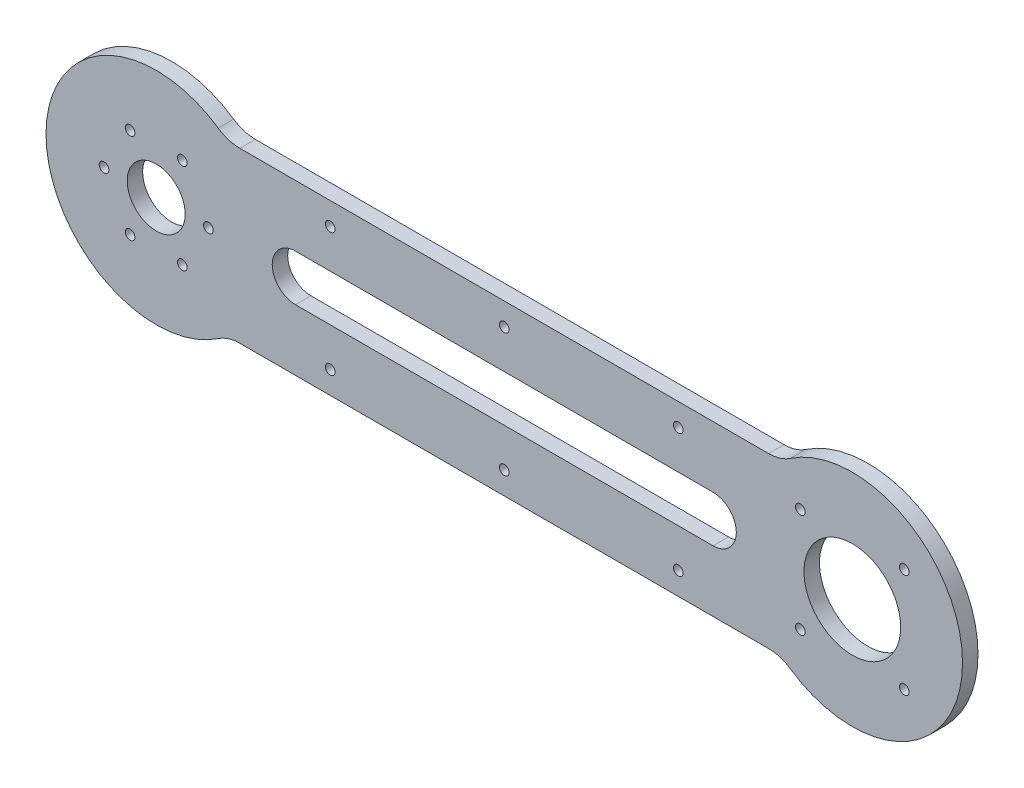
ISO-10303-21;
HEADER;
FILE_DESCRIPTION(('STEP AP214'),'2;1');
FILE_NAME('part.step','',(''),(''),'','','');
FILE_SCHEMA(('AUTOMOTIVE_DESIGN { 1 0 10303 214 1 1 1 1 }'));
ENDSEC;
DATA;
#1=APPLICATION_CONTEXT('core data for automotive mechanical design processes');
#2=APPLICATION_PROTOCOL_DEFINITION('international standard','automotive_design',2000,#1);
#3=PRODUCT_CONTEXT('',#1,'mechanical');
#4=PRODUCT('Part','Part','',(#3));
#5=PRODUCT_RELATED_PRODUCT_CATEGORY('part','',(#4));
#6=PRODUCT_DEFINITION_FORMATION('','',#4);
#7=PRODUCT_DEFINITION_CONTEXT('part definition',#1,'design');
#8=PRODUCT_DEFINITION('design','',#6,#7);
#9=PRODUCT_DEFINITION_SHAPE('','',#8);
#10=(LENGTH_UNIT() NAMED_UNIT(*) SI_UNIT(.MILLI.,.METRE.));
#11=(NAMED_UNIT(*) PLANE_ANGLE_UNIT() SI_UNIT($,.RADIAN.));
#12=(NAMED_UNIT(*) SI_UNIT($,.STERADIAN.) SOLID_ANGLE_UNIT());
#13=UNCERTAINTY_MEASURE_WITH_UNIT(LENGTH_MEASURE(1.E-05),#10,'distance_accuracy_value','');
#14=(GEOMETRIC_REPRESENTATION_CONTEXT(3) GLOBAL_UNCERTAINTY_ASSIGNED_CONTEXT((#13)) GLOBAL_UNIT_ASSIGNED_CONTEXT((#10,
#11,#12)) REPRESENTATION_CONTEXT('',''));
#15=CARTESIAN_POINT('',(0.,0.,0.));
#16=DIRECTION('',(0.,0.,1.));
#17=DIRECTION('',(1.,0.,0.));
#18=AXIS2_PLACEMENT_3D('',#15,#16,#17);
#19=CARTESIAN_POINT('',(135.,-16.,-1.));
#20=DIRECTION('',(0.,0.,1.));
#21=DIRECTION('',(1.,0.,0.));
#22=AXIS2_PLACEMENT_3D('',#19,#20,#21);
#23=CYLINDRICAL_SURFACE('',#22,1.25);
#24=CARTESIAN_POINT('',(135.,-16.,4.));
#25=DIRECTION('',(0.,0.,1.));
#26=DIRECTION('',(-1.,0.,0.));
#27=AXIS2_PLACEMENT_3D('',#24,#25,#26);
#28=CIRCLE('',#27,1.25);
#29=CARTESIAN_POINT('',(133.75,-16.,4.));
#30=VERTEX_POINT('',#29);
#31=EDGE_CURVE('E55',#30,#30,#28,.T.);
#32=ORIENTED_EDGE('',*,*,#31,.T.);
#33=EDGE_LOOP('',(#32));
#34=FACE_BOUND('',#33,.T.);
#35=CARTESIAN_POINT('',(135.,-16.,0.));
#36=DIRECTION('',(0.,0.,1.));
#37=DIRECTION('',(1.,0.,0.));
#38=AXIS2_PLACEMENT_3D('',#35,#36,#37);
#39=CIRCLE('',#38,1.25);
#40=CARTESIAN_POINT('',(136.25,-16.,0.));
#41=VERTEX_POINT('',#40);
#42=EDGE_CURVE('E11',#41,#41,#39,.T.);
#43=ORIENTED_EDGE('',*,*,#42,.F.);
#44=EDGE_LOOP('',(#43));
#45=FACE_BOUND('',#44,.T.);
#46=ADVANCED_FACE('F47',(#34,#45),#23,.F.);
#47=CARTESIAN_POINT('',(135.,16.,-1.));
#48=DIRECTION('',(0.,0.,1.));
#49=DIRECTION('',(1.,0.,0.));
#50=AXIS2_PLACEMENT_3D('',#47,#48,#49);
#51=CYLINDRICAL_SURFACE('',#50,1.25);
#52=CARTESIAN_POINT('',(135.,16.,4.));
#53=DIRECTION('',(0.,0.,1.));
#54=DIRECTION('',(1.,0.,0.));
#55=AXIS2_PLACEMENT_3D('',#52,#53,#54);
#56=CIRCLE('',#55,1.25);
#57=CARTESIAN_POINT('',(136.25,16.,4.));
#58=VERTEX_POINT('',#57);
#59=EDGE_CURVE('E308',#58,#58,#56,.T.);
#60=ORIENTED_EDGE('',*,*,#59,.T.);
#61=EDGE_LOOP('',(#60));
#62=FACE_BOUND('',#61,.T.);
#63=CARTESIAN_POINT('',(135.,16.,0.));
#64=DIRECTION('',(0.,0.,1.));
#65=DIRECTION('',(1.,0.,0.));
#66=AXIS2_PLACEMENT_3D('',#63,#64,#65);
#67=CIRCLE('',#66,1.25);
#68=CARTESIAN_POINT('',(136.25,16.,0.));
#69=VERTEX_POINT('',#68);
#70=EDGE_CURVE('E322',#69,#69,#67,.T.);
#71=ORIENTED_EDGE('',*,*,#70,.F.);
#72=EDGE_LOOP('',(#71));
#73=FACE_BOUND('',#72,.T.);
#74=ADVANCED_FACE('F347',(#62,#73),#51,.F.);
#75=CARTESIAN_POINT('',(144.,0.,0.));
#76=DIRECTION('',(0.,0.,1.));
#77=DIRECTION('',(1.,0.,0.));
#78=AXIS2_PLACEMENT_3D('',#75,#76,#77);
#79=CYLINDRICAL_SURFACE('',#78,6.);
#80=DIRECTION('',(0.,0.,-1.));
#81=VECTOR('',#80,1.);
#82=CARTESIAN_POINT('',(144.,6.,0.));
#83=LINE('',#82,#81);
#84=CARTESIAN_POINT('',(144.,6.,0.));
#85=VERTEX_POINT('',#84);
#86=CARTESIAN_POINT('',(144.,6.,4.));
#87=VERTEX_POINT('',#86);
#88=EDGE_CURVE('E297',#85,#87,#83,.F.);
#89=ORIENTED_EDGE('',*,*,#88,.F.);
#90=CARTESIAN_POINT('',(144.,0.,0.));
#91=DIRECTION('',(0.,0.,1.));
#92=DIRECTION('',(1.,0.,0.));
#93=AXIS2_PLACEMENT_3D('',#90,#91,#92);
#94=CIRCLE('',#93,6.);
#95=CARTESIAN_POINT('',(144.,-6.,0.));
#96=VERTEX_POINT('',#95);
#97=EDGE_CURVE('E69',#85,#96,#94,.F.);
#98=ORIENTED_EDGE('',*,*,#97,.T.);
#99=DIRECTION('',(0.,0.,-1.));
#100=VECTOR('',#99,1.);
#101=CARTESIAN_POINT('',(144.,-6.,0.));
#102=LINE('',#101,#100);
#103=CARTESIAN_POINT('',(144.,-6.,4.));
#104=VERTEX_POINT('',#103);
#105=EDGE_CURVE('E301',#104,#96,#102,.T.);
#106=ORIENTED_EDGE('',*,*,#105,.F.);
#107=CARTESIAN_POINT('',(144.,0.,4.));
#108=DIRECTION('',(0.,0.,1.));
#109=DIRECTION('',(1.,0.,0.));
#110=AXIS2_PLACEMENT_3D('',#107,#108,#109);
#111=CIRCLE('',#110,6.);
#112=EDGE_CURVE('E62',#104,#87,#111,.T.);
#113=ORIENTED_EDGE('',*,*,#112,.T.);
#114=EDGE_LOOP('',(#89,#98,#106,#113));
#115=FACE_BOUND('',#114,.T.);
#116=ADVANCED_FACE('F351',(#115),#79,.F.);
#117=CARTESIAN_POINT('',(36.,0.,4.));
#118=DIRECTION('',(0.,0.,1.));
#119=DIRECTION('',(1.,0.,0.));
#120=AXIS2_PLACEMENT_3D('',#117,#118,#119);
#121=CYLINDRICAL_SURFACE('',#120,6.);
#122=DIRECTION('',(0.,0.,-1.));
#123=VECTOR('',#122,1.);
#124=CARTESIAN_POINT('',(36.,6.,4.));
#125=LINE('',#124,#123);
#126=CARTESIAN_POINT('',(36.,6.,4.));
#127=VERTEX_POINT('',#126);
#128=CARTESIAN_POINT('',(36.,6.,0.));
#129=VERTEX_POINT('',#128);
#130=EDGE_CURVE('E282',#127,#129,#125,.T.);
#131=ORIENTED_EDGE('',*,*,#130,.F.);
#132=CARTESIAN_POINT('',(36.,0.,4.));
#133=DIRECTION('',(0.,0.,1.));
#134=DIRECTION('',(1.,0.,0.));
#135=AXIS2_PLACEMENT_3D('',#132,#133,#134);
#136=CIRCLE('',#135,6.);
#137=CARTESIAN_POINT('',(36.,-6.,4.));
#138=VERTEX_POINT('',#137);
#139=EDGE_CURVE('E290',#127,#138,#136,.T.);
#140=ORIENTED_EDGE('',*,*,#139,.T.);
#141=DIRECTION('',(0.,0.,-1.));
#142=VECTOR('',#141,1.);
#143=CARTESIAN_POINT('',(36.,-6.,4.));
#144=LINE('',#143,#142);
#145=CARTESIAN_POINT('',(36.,-6.,0.));
#146=VERTEX_POINT('',#145);
#147=EDGE_CURVE('E286',#146,#138,#144,.F.);
#148=ORIENTED_EDGE('',*,*,#147,.F.);
#149=CARTESIAN_POINT('',(36.,0.,0.));
#150=DIRECTION('',(0.,0.,1.));
#151=DIRECTION('',(1.,0.,0.));
#152=AXIS2_PLACEMENT_3D('',#149,#150,#151);
#153=CIRCLE('',#152,6.);
#154=EDGE_CURVE('E293',#146,#129,#153,.F.);
#155=ORIENTED_EDGE('',*,*,#154,.T.);
#156=EDGE_LOOP('',(#131,#140,#148,#155));
#157=FACE_BOUND('',#156,.T.);
#158=ADVANCED_FACE('F356',(#157),#121,.F.);
#159=CARTESIAN_POINT('',(0.,0.,4.));
#160=DIRECTION('',(0.,0.,-1.));
#161=DIRECTION('',(-1.,0.,0.));
#162=AXIS2_PLACEMENT_3D('',#159,#160,#161);
#163=CYLINDRICAL_SURFACE('',#162,28.5);
#164=CARTESIAN_POINT('',(0.,0.,0.));
#165=DIRECTION('',(0.,0.,1.));
#166=DIRECTION('',(1.,0.,0.));
#167=AXIS2_PLACEMENT_3D('',#164,#165,#166);
#168=CIRCLE('',#167,28.5);
#169=CARTESIAN_POINT('',(16.0306285065469,23.5641454265816,0.));
#170=VERTEX_POINT('',#169);
#171=CARTESIAN_POINT('',(16.0306285065469,-23.5641454265816,0.));
#172=VERTEX_POINT('',#171);
#173=EDGE_CURVE('E229',#170,#172,#168,.T.);
#174=ORIENTED_EDGE('',*,*,#173,.T.);
#175=DIRECTION('',(0.,0.,-1.));
#176=VECTOR('',#175,1.);
#177=CARTESIAN_POINT('',(16.0306285065469,-23.5641454265816,4.));
#178=LINE('',#177,#176);
#179=CARTESIAN_POINT('',(16.0306285065469,-23.5641454265816,4.));
#180=VERTEX_POINT('',#179);
#181=EDGE_CURVE('E149',#172,#180,#178,.F.);
#182=ORIENTED_EDGE('',*,*,#181,.T.);
#183=CARTESIAN_POINT('',(0.,0.,4.));
#184=DIRECTION('',(0.,0.,1.));
#185=DIRECTION('',(1.,0.,0.));
#186=AXIS2_PLACEMENT_3D('',#183,#184,#185);
#187=CIRCLE('',#186,28.5);
#188=CARTESIAN_POINT('',(16.0306285065469,23.5641454265816,4.));
#189=VERTEX_POINT('',#188);
#190=EDGE_CURVE('E168',#189,#180,#187,.T.);
#191=ORIENTED_EDGE('',*,*,#190,.F.);
#192=DIRECTION('',(0.,0.,-1.));
#193=VECTOR('',#192,1.);
#194=CARTESIAN_POINT('',(16.0306285065469,23.5641454265816,4.));
#195=LINE('',#194,#193);
#196=EDGE_CURVE('E194',#189,#170,#195,.T.);
#197=ORIENTED_EDGE('',*,*,#196,.T.);
#198=EDGE_LOOP('',(#174,#182,#191,#197));
#199=FACE_BOUND('',#198,.T.);
#200=ADVANCED_FACE('F368',(#199),#163,.T.);
#201=CARTESIAN_POINT('',(18.3194468760663,-21.8322666288909,4.));
#202=DIRECTION('',(0.,1.,0.));
#203=DIRECTION('',(0.,0.,1.));
#204=AXIS2_PLACEMENT_3D('',#201,#202,#203);
#205=PLANE('',#204);
#206=DIRECTION('',(1.,0.,0.));
#207=VECTOR('',#206,1.);
#208=CARTESIAN_POINT('',(18.3194468760663,-21.8322666288909,0.));
#209=LINE('',#208,#207);
#210=CARTESIAN_POINT('',(21.6554104386686,-21.8322666288909,0.));
#211=VERTEX_POINT('',#210);
#212=CARTESIAN_POINT('',(158.344589561331,-21.8322666288909,0.));
#213=VERTEX_POINT('',#212);
#214=EDGE_CURVE('E176',#211,#213,#209,.T.);
#215=ORIENTED_EDGE('',*,*,#214,.T.);
#216=DIRECTION('',(0.,0.,1.));
#217=VECTOR('',#216,1.);
#218=CARTESIAN_POINT('',(158.344589561331,-21.8322666288909,4.));
#219=LINE('',#218,#217);
#220=CARTESIAN_POINT('',(158.344589561331,-21.8322666288909,4.));
#221=VERTEX_POINT('',#220);
#222=EDGE_CURVE('E191',#213,#221,#219,.T.);
#223=ORIENTED_EDGE('',*,*,#222,.T.);
#224=DIRECTION('',(1.,0.,0.));
#225=VECTOR('',#224,1.);
#226=CARTESIAN_POINT('',(18.3194468760663,-21.8322666288909,4.));
#227=LINE('',#226,#225);
#228=CARTESIAN_POINT('',(21.6554104386686,-21.8322666288909,4.));
#229=VERTEX_POINT('',#228);
#230=EDGE_CURVE('E174',#229,#221,#227,.T.);
#231=ORIENTED_EDGE('',*,*,#230,.F.);
#232=DIRECTION('',(0.,0.,1.));
#233=VECTOR('',#232,1.);
#234=CARTESIAN_POINT('',(21.6554104386686,-21.8322666288909,0.));
#235=LINE('',#234,#233);
#236=EDGE_CURVE('E187',#229,#211,#235,.F.);
#237=ORIENTED_EDGE('',*,*,#236,.T.);
#238=EDGE_LOOP('',(#215,#223,#231,#237));
#239=FACE_BOUND('',#238,.T.);
#240=ADVANCED_FACE('F387',(#239),#205,.F.);
#241=CARTESIAN_POINT('',(180.,0.,4.));
#242=DIRECTION('',(0.,0.,-1.));
#243=DIRECTION('',(-1.,0.,0.));
#244=AXIS2_PLACEMENT_3D('',#241,#242,#243);
#245=CYLINDRICAL_SURFACE('',#244,28.5);
#246=CARTESIAN_POINT('',(180.,0.,0.));
#247=DIRECTION('',(0.,0.,1.));
#248=DIRECTION('',(1.,0.,0.));
#249=AXIS2_PLACEMENT_3D('',#246,#247,#248);
#250=CIRCLE('',#249,28.5);
#251=CARTESIAN_POINT('',(163.969371493453,-23.5641454265816,0.));
#252=VERTEX_POINT('',#251);
#253=CARTESIAN_POINT('',(163.969371493453,23.5641454265816,0.));
#254=VERTEX_POINT('',#253);
#255=EDGE_CURVE('E169',#252,#254,#250,.T.);
#256=ORIENTED_EDGE('',*,*,#255,.T.);
#257=DIRECTION('',(0.,0.,-1.));
#258=VECTOR('',#257,1.);
#259=CARTESIAN_POINT('',(163.969371493453,23.5641454265816,4.));
#260=LINE('',#259,#258);
#261=CARTESIAN_POINT('',(163.969371493453,23.5641454265816,4.));
#262=VERTEX_POINT('',#261);
#263=EDGE_CURVE('E142',#254,#262,#260,.F.);
#264=ORIENTED_EDGE('',*,*,#263,.T.);
#265=CARTESIAN_POINT('',(180.,0.,4.));
#266=DIRECTION('',(0.,0.,1.));
#267=DIRECTION('',(1.,0.,0.));
#268=AXIS2_PLACEMENT_3D('',#265,#266,#267);
#269=CIRCLE('',#268,28.5);
#270=CARTESIAN_POINT('',(163.969371493453,-23.5641454265816,4.));
#271=VERTEX_POINT('',#270);
#272=EDGE_CURVE('E409',#271,#262,#269,.T.);
#273=ORIENTED_EDGE('',*,*,#272,.F.);
#274=DIRECTION('',(0.,0.,-1.));
#275=VECTOR('',#274,1.);
#276=CARTESIAN_POINT('',(163.969371493453,-23.5641454265816,4.));
#277=LINE('',#276,#275);
#278=EDGE_CURVE('E160',#271,#252,#277,.T.);
#279=ORIENTED_EDGE('',*,*,#278,.T.);
#280=EDGE_LOOP('',(#256,#264,#273,#279));
#281=FACE_BOUND('',#280,.T.);
#282=ADVANCED_FACE('F341',(#281),#245,.T.);
#283=CARTESIAN_POINT('',(18.3194468760663,21.8322666288909,4.));
#284=DIRECTION('',(0.,-1.,0.));
#285=DIRECTION('',(0.,0.,-1.));
#286=AXIS2_PLACEMENT_3D('',#283,#284,#285);
#287=PLANE('',#286);
#288=DIRECTION('',(-1.,0.,0.));
#289=VECTOR('',#288,1.);
#290=CARTESIAN_POINT('',(18.3194468760663,21.8322666288909,4.));
#291=LINE('',#290,#289);
#292=CARTESIAN_POINT('',(158.344589561331,21.8322666288909,4.));
#293=VERTEX_POINT('',#292);
#294=CARTESIAN_POINT('',(21.6554104386686,21.8322666288909,4.));
#295=VERTEX_POINT('',#294);
#296=EDGE_CURVE('E158',#293,#295,#291,.T.);
#297=ORIENTED_EDGE('',*,*,#296,.F.);
#298=DIRECTION('',(0.,0.,1.));
#299=VECTOR('',#298,1.);
#300=CARTESIAN_POINT('',(158.344589561331,21.8322666288909,0.));
#301=LINE('',#300,#299);
#302=CARTESIAN_POINT('',(158.344589561331,21.8322666288909,0.));
#303=VERTEX_POINT('',#302);
#304=EDGE_CURVE('E141',#293,#303,#301,.F.);
#305=ORIENTED_EDGE('',*,*,#304,.T.);
#306=DIRECTION('',(-1.,0.,0.));
#307=VECTOR('',#306,1.);
#308=CARTESIAN_POINT('',(18.3194468760663,21.8322666288909,0.));
#309=LINE('',#308,#307);
#310=CARTESIAN_POINT('',(21.6554104386686,21.8322666288909,0.));
#311=VERTEX_POINT('',#310);
#312=EDGE_CURVE('E155',#303,#311,#309,.T.);
#313=ORIENTED_EDGE('',*,*,#312,.T.);
#314=DIRECTION('',(0.,0.,1.));
#315=VECTOR('',#314,1.);
#316=CARTESIAN_POINT('',(21.6554104386686,21.8322666288909,4.));
#317=LINE('',#316,#315);
#318=EDGE_CURVE('E161',#311,#295,#317,.T.);
#319=ORIENTED_EDGE('',*,*,#318,.T.);
#320=EDGE_LOOP('',(#297,#305,#313,#319));
#321=FACE_BOUND('',#320,.T.);
#322=ADVANCED_FACE('F154',(#321),#287,.F.);
#323=CARTESIAN_POINT('',(0.,0.,4.));
#324=DIRECTION('',(0.,0.,1.));
#325=DIRECTION('',(1.,0.,0.));
#326=AXIS2_PLACEMENT_3D('',#323,#324,#325);
#327=PLANE('',#326);
#328=CARTESIAN_POINT('',(90.,-16.,4.));
#329=DIRECTION('',(0.,0.,1.));
#330=DIRECTION('',(-1.,0.,0.));
#331=AXIS2_PLACEMENT_3D('',#328,#329,#330);
#332=CIRCLE('',#331,1.25);
#333=CARTESIAN_POINT('',(88.75,-16.,4.));
#334=VERTEX_POINT('',#333);
#335=EDGE_CURVE('E490',#334,#334,#332,.T.);
#336=ORIENTED_EDGE('',*,*,#335,.F.);
#337=EDGE_LOOP('',(#336));
#338=FACE_BOUND('',#337,.T.);
#339=CARTESIAN_POINT('',(90.,16.,4.));
#340=DIRECTION('',(0.,0.,1.));
#341=DIRECTION('',(1.,0.,0.));
#342=AXIS2_PLACEMENT_3D('',#339,#340,#341);
#343=CIRCLE('',#342,1.25);
#344=CARTESIAN_POINT('',(91.25,16.,4.));
#345=VERTEX_POINT('',#344);
#346=EDGE_CURVE('E482',#345,#345,#343,.T.);
#347=ORIENTED_EDGE('',*,*,#346,.F.);
#348=EDGE_LOOP('',(#347));
#349=FACE_BOUND('',#348,.T.);
#350=CARTESIAN_POINT('',(45.,16.,4.));
#351=DIRECTION('',(0.,0.,1.));
#352=DIRECTION('',(1.,0.,0.));
#353=AXIS2_PLACEMENT_3D('',#350,#351,#352);
#354=CIRCLE('',#353,1.25);
#355=CARTESIAN_POINT('',(46.25,16.,4.));
#356=VERTEX_POINT('',#355);
#357=EDGE_CURVE('E314',#356,#356,#354,.T.);
#358=ORIENTED_EDGE('',*,*,#357,.F.);
#359=EDGE_LOOP('',(#358));
#360=FACE_BOUND('',#359,.T.);
#361=CARTESIAN_POINT('',(45.,-16.,4.));
#362=DIRECTION('',(0.,0.,1.));
#363=DIRECTION('',(-1.,0.,0.));
#364=AXIS2_PLACEMENT_3D('',#361,#362,#363);
#365=CIRCLE('',#364,1.25);
#366=CARTESIAN_POINT('',(43.75,-16.,4.));
#367=VERTEX_POINT('',#366);
#368=EDGE_CURVE('E474',#367,#367,#365,.T.);
#369=ORIENTED_EDGE('',*,*,#368,.F.);
#370=EDGE_LOOP('',(#369));
#371=FACE_BOUND('',#370,.T.);
#372=DIRECTION('',(-1.,0.,0.));
#373=VECTOR('',#372,1.);
#374=CARTESIAN_POINT('',(30.,6.,4.));
#375=LINE('',#374,#373);
#376=EDGE_CURVE('E318',#87,#127,#375,.T.);
#377=ORIENTED_EDGE('',*,*,#376,.F.);
#378=ORIENTED_EDGE('',*,*,#112,.F.);
#379=DIRECTION('',(1.,0.,0.));
#380=VECTOR('',#379,1.);
#381=CARTESIAN_POINT('',(30.,-6.,4.));
#382=LINE('',#381,#380);
#383=EDGE_CURVE('E465',#138,#104,#382,.T.);
#384=ORIENTED_EDGE('',*,*,#383,.F.);
#385=ORIENTED_EDGE('',*,*,#139,.F.);
#386=EDGE_LOOP('',(#377,#378,#384,#385));
#387=FACE_BOUND('',#386,.T.);
#388=CARTESIAN_POINT('',(166.564971157456,-13.4350288425444,4.));
#389=DIRECTION('',(0.,0.,1.));
#390=DIRECTION('',(-1.,0.,0.));
#391=AXIS2_PLACEMENT_3D('',#388,#389,#390);
#392=CIRCLE('',#391,1.25000000000001);
#393=CARTESIAN_POINT('',(165.314971157456,-13.4350288425444,4.));
#394=VERTEX_POINT('',#393);
#395=EDGE_CURVE('E457',#394,#394,#392,.T.);
#396=ORIENTED_EDGE('',*,*,#395,.F.);
#397=EDGE_LOOP('',(#396));
#398=FACE_BOUND('',#397,.T.);
#399=CARTESIAN_POINT('',(166.564971157456,13.4350288425443,4.));
#400=DIRECTION('',(0.,0.,1.));
#401=DIRECTION('',(0.,1.,0.));
#402=AXIS2_PLACEMENT_3D('',#399,#400,#401);
#403=CIRCLE('',#402,1.25000000000001);
#404=CARTESIAN_POINT('',(166.564971157456,14.6850288425443,4.));
#405=VERTEX_POINT('',#404);
#406=EDGE_CURVE('E267',#405,#405,#403,.T.);
#407=ORIENTED_EDGE('',*,*,#406,.F.);
#408=EDGE_LOOP('',(#407));
#409=FACE_BOUND('',#408,.T.);
#410=CARTESIAN_POINT('',(193.435028842545,-13.4350288425442,4.));
#411=DIRECTION('',(0.,0.,1.));
#412=DIRECTION('',(0.,-1.,0.));
#413=AXIS2_PLACEMENT_3D('',#410,#411,#412);
#414=CIRCLE('',#413,1.25000000000001);
#415=CARTESIAN_POINT('',(193.435028842545,-14.6850288425443,4.));
#416=VERTEX_POINT('',#415);
#417=EDGE_CURVE('E461',#416,#416,#414,.T.);
#418=ORIENTED_EDGE('',*,*,#417,.F.);
#419=EDGE_LOOP('',(#418));
#420=FACE_BOUND('',#419,.T.);
#421=CARTESIAN_POINT('',(193.435028842544,13.4350288425444,4.));
#422=DIRECTION('',(0.,0.,1.));
#423=DIRECTION('',(1.,0.,0.));
#424=AXIS2_PLACEMENT_3D('',#421,#422,#423);
#425=CIRCLE('',#424,1.25000000000001);
#426=CARTESIAN_POINT('',(194.685028842544,13.4350288425444,4.));
#427=VERTEX_POINT('',#426);
#428=EDGE_CURVE('E275',#427,#427,#425,.T.);
#429=ORIENTED_EDGE('',*,*,#428,.F.);
#430=EDGE_LOOP('',(#429));
#431=FACE_BOUND('',#430,.T.);
#432=CARTESIAN_POINT('',(180.,0.,4.));
#433=DIRECTION('',(0.,0.,1.));
#434=DIRECTION('',(1.,0.,0.));
#435=AXIS2_PLACEMENT_3D('',#432,#433,#434);
#436=CIRCLE('',#435,12.5);
#437=CARTESIAN_POINT('',(192.5,0.,4.));
#438=VERTEX_POINT('',#437);
#439=EDGE_CURVE('E257',#438,#438,#436,.T.);
#440=ORIENTED_EDGE('',*,*,#439,.F.);
#441=EDGE_LOOP('',(#440));
#442=FACE_BOUND('',#441,.T.);
#443=CARTESIAN_POINT('',(13.5,0.,4.));
#444=DIRECTION('',(0.,0.,1.));
#445=DIRECTION('',(-1.,0.,0.));
#446=AXIS2_PLACEMENT_3D('',#443,#444,#445);
#447=CIRCLE('',#446,1.25);
#448=CARTESIAN_POINT('',(12.25,0.,4.));
#449=VERTEX_POINT('',#448);
#450=EDGE_CURVE('E437',#449,#449,#447,.T.);
#451=ORIENTED_EDGE('',*,*,#450,.F.);
#452=EDGE_LOOP('',(#451));
#453=FACE_BOUND('',#452,.T.);
#454=CARTESIAN_POINT('',(6.74999999999989,11.69134295109,4.));
#455=DIRECTION('',(0.,0.,1.));
#456=DIRECTION('',(-0.499999999999992,-0.866025403784443,0.));
#457=AXIS2_PLACEMENT_3D('',#454,#455,#456);
#458=CIRCLE('',#457,1.25);
#459=CARTESIAN_POINT('',(6.1249999999999,10.6088111963594,4.));
#460=VERTEX_POINT('',#459);
#461=EDGE_CURVE('E441',#460,#460,#458,.T.);
#462=ORIENTED_EDGE('',*,*,#461,.F.);
#463=EDGE_LOOP('',(#462));
#464=FACE_BOUND('',#463,.T.);
#465=CARTESIAN_POINT('',(-6.74999999999997,-11.6913429510899,4.));
#466=DIRECTION('',(0.,0.,1.));
#467=DIRECTION('',(0.499999999999998,0.86602540378444,0.));
#468=AXIS2_PLACEMENT_3D('',#465,#466,#467);
#469=CIRCLE('',#468,1.25);
#470=CARTESIAN_POINT('',(-6.12499999999998,-10.6088111963594,4.));
#471=VERTEX_POINT('',#470);
#472=EDGE_CURVE('E235',#471,#471,#469,.T.);
#473=ORIENTED_EDGE('',*,*,#472,.F.);
#474=EDGE_LOOP('',(#473));
#475=FACE_BOUND('',#474,.T.);
#476=CARTESIAN_POINT('',(6.75000000000006,-11.6913429510899,4.));
#477=DIRECTION('',(0.,0.,1.));
#478=DIRECTION('',(-0.500000000000004,0.866025403784436,0.));
#479=AXIS2_PLACEMENT_3D('',#476,#477,#478);
#480=CIRCLE('',#479,1.25);
#481=CARTESIAN_POINT('',(6.12500000000005,-10.6088111963593,4.));
#482=VERTEX_POINT('',#481);
#483=EDGE_CURVE('E433',#482,#482,#480,.T.);
#484=ORIENTED_EDGE('',*,*,#483,.F.);
#485=EDGE_LOOP('',(#484));
#486=FACE_BOUND('',#485,.T.);
#487=CARTESIAN_POINT('',(-6.75000000000014,11.6913429510898,4.));
#488=DIRECTION('',(0.,0.,1.));
#489=DIRECTION('',(0.50000000000001,-0.866025403784433,0.));
#490=AXIS2_PLACEMENT_3D('',#487,#488,#489);
#491=CIRCLE('',#490,1.25);
#492=CARTESIAN_POINT('',(-6.12500000000012,10.6088111963593,4.));
#493=VERTEX_POINT('',#492);
#494=EDGE_CURVE('E261',#493,#493,#491,.T.);
#495=ORIENTED_EDGE('',*,*,#494,.F.);
#496=EDGE_LOOP('',(#495));
#497=FACE_BOUND('',#496,.T.);
#498=CARTESIAN_POINT('',(0.,0.,4.));
#499=DIRECTION('',(0.,0.,1.));
#500=DIRECTION('',(1.,0.,0.));
#501=AXIS2_PLACEMENT_3D('',#498,#499,#500);
#502=CIRCLE('',#501,7.5);
#503=CARTESIAN_POINT('',(7.5,0.,4.));
#504=VERTEX_POINT('',#503);
#505=EDGE_CURVE('E225',#504,#504,#502,.T.);
#506=ORIENTED_EDGE('',*,*,#505,.F.);
#507=EDGE_LOOP('',(#506));
#508=FACE_BOUND('',#507,.T.);
#509=CARTESIAN_POINT('',(-13.5,0.,4.));
#510=DIRECTION('',(0.,0.,1.));
#511=DIRECTION('',(1.,0.,0.));
#512=AXIS2_PLACEMENT_3D('',#509,#510,#511);
#513=CIRCLE('',#512,1.25);
#514=CARTESIAN_POINT('',(-12.25,0.,4.));
#515=VERTEX_POINT('',#514);
#516=EDGE_CURVE('E251',#515,#515,#513,.T.);
#517=ORIENTED_EDGE('',*,*,#516,.F.);
#518=EDGE_LOOP('',(#517));
#519=FACE_BOUND('',#518,.T.);
#520=ORIENTED_EDGE('',*,*,#296,.T.);
#521=CARTESIAN_POINT('',(21.6554104386686,31.8322666288909,4.));
#522=DIRECTION('',(0.,0.,1.));
#523=DIRECTION('',(1.,0.,0.));
#524=AXIS2_PLACEMENT_3D('',#521,#522,#523);
#525=CIRCLE('',#524,10.);
#526=EDGE_CURVE('E216',#295,#189,#525,.F.);
#527=ORIENTED_EDGE('',*,*,#526,.T.);
#528=ORIENTED_EDGE('',*,*,#190,.T.);
#529=CARTESIAN_POINT('',(21.6554104386686,-31.8322666288909,4.));
#530=DIRECTION('',(0.,0.,1.));
#531=DIRECTION('',(1.,0.,0.));
#532=AXIS2_PLACEMENT_3D('',#529,#530,#531);
#533=CIRCLE('',#532,10.);
#534=EDGE_CURVE('E211',#180,#229,#533,.F.);
#535=ORIENTED_EDGE('',*,*,#534,.T.);
#536=ORIENTED_EDGE('',*,*,#230,.T.);
#537=CARTESIAN_POINT('',(158.344589561331,-31.8322666288909,4.));
#538=DIRECTION('',(0.,0.,1.));
#539=DIRECTION('',(1.,0.,0.));
#540=AXIS2_PLACEMENT_3D('',#537,#538,#539);
#541=CIRCLE('',#540,10.);
#542=EDGE_CURVE('E205',#221,#271,#541,.F.);
#543=ORIENTED_EDGE('',*,*,#542,.T.);
#544=ORIENTED_EDGE('',*,*,#272,.T.);
#545=CARTESIAN_POINT('',(158.344589561331,31.8322666288909,4.));
#546=DIRECTION('',(0.,0.,1.));
#547=DIRECTION('',(1.,0.,0.));
#548=AXIS2_PLACEMENT_3D('',#545,#546,#547);
#549=CIRCLE('',#548,10.);
#550=EDGE_CURVE('E148',#262,#293,#549,.F.);
#551=ORIENTED_EDGE('',*,*,#550,.T.);
#552=EDGE_LOOP('',(#520,#527,#528,#535,#536,#543,#544,#551));
#553=FACE_BOUND('',#552,.T.);
#554=ORIENTED_EDGE('',*,*,#59,.F.);
#555=EDGE_LOOP('',(#554));
#556=FACE_BOUND('',#555,.T.);
#557=ORIENTED_EDGE('',*,*,#31,.F.);
#558=EDGE_LOOP('',(#557));
#559=FACE_BOUND('',#558,.T.);
#560=ADVANCED_FACE('F331',(#338,#349,#360,#371,#387,#398,#409,#420,#431,#442,#453,#464,#475,
#486,#497,#508,#519,#553,#556,#559),#327,.T.);
#561=CARTESIAN_POINT('',(0.,0.,0.));
#562=DIRECTION('',(0.,0.,1.));
#563=DIRECTION('',(1.,0.,0.));
#564=AXIS2_PLACEMENT_3D('',#561,#562,#563);
#565=PLANE('',#564);
#566=CARTESIAN_POINT('',(90.,-16.,0.));
#567=DIRECTION('',(0.,0.,1.));
#568=DIRECTION('',(1.,0.,0.));
#569=AXIS2_PLACEMENT_3D('',#566,#567,#568);
#570=CIRCLE('',#569,1.25);
#571=CARTESIAN_POINT('',(91.25,-16.,0.));
#572=VERTEX_POINT('',#571);
#573=EDGE_CURVE('E486',#572,#572,#570,.T.);
#574=ORIENTED_EDGE('',*,*,#573,.T.);
#575=EDGE_LOOP('',(#574));
#576=FACE_BOUND('',#575,.T.);
#577=CARTESIAN_POINT('',(90.,16.,0.));
#578=DIRECTION('',(0.,0.,1.));
#579=DIRECTION('',(1.,0.,0.));
#580=AXIS2_PLACEMENT_3D('',#577,#578,#579);
#581=CIRCLE('',#580,1.25);
#582=CARTESIAN_POINT('',(91.25,16.,0.));
#583=VERTEX_POINT('',#582);
#584=EDGE_CURVE('E478',#583,#583,#581,.T.);
#585=ORIENTED_EDGE('',*,*,#584,.T.);
#586=EDGE_LOOP('',(#585));
#587=FACE_BOUND('',#586,.T.);
#588=CARTESIAN_POINT('',(45.,16.,0.));
#589=DIRECTION('',(0.,0.,1.));
#590=DIRECTION('',(1.,0.,0.));
#591=AXIS2_PLACEMENT_3D('',#588,#589,#590);
#592=CIRCLE('',#591,1.25);
#593=CARTESIAN_POINT('',(46.25,16.,0.));
#594=VERTEX_POINT('',#593);
#595=EDGE_CURVE('E313',#594,#594,#592,.T.);
#596=ORIENTED_EDGE('',*,*,#595,.T.);
#597=EDGE_LOOP('',(#596));
#598=FACE_BOUND('',#597,.T.);
#599=CARTESIAN_POINT('',(45.,-16.,0.));
#600=DIRECTION('',(0.,0.,1.));
#601=DIRECTION('',(1.,0.,0.));
#602=AXIS2_PLACEMENT_3D('',#599,#600,#601);
#603=CIRCLE('',#602,1.25);
#604=CARTESIAN_POINT('',(46.25,-16.,0.));
#605=VERTEX_POINT('',#604);
#606=EDGE_CURVE('E309',#605,#605,#603,.T.);
#607=ORIENTED_EDGE('',*,*,#606,.T.);
#608=EDGE_LOOP('',(#607));
#609=FACE_BOUND('',#608,.T.);
#610=ORIENTED_EDGE('',*,*,#97,.F.);
#611=DIRECTION('',(-1.,0.,0.));
#612=VECTOR('',#611,1.);
#613=CARTESIAN_POINT('',(0.,6.,0.));
#614=LINE('',#613,#612);
#615=EDGE_CURVE('E279',#85,#129,#614,.T.);
#616=ORIENTED_EDGE('',*,*,#615,.T.);
#617=ORIENTED_EDGE('',*,*,#154,.F.);
#618=DIRECTION('',(1.,0.,0.));
#619=VECTOR('',#618,1.);
#620=CARTESIAN_POINT('',(0.,-6.,0.));
#621=LINE('',#620,#619);
#622=EDGE_CURVE('E219',#146,#96,#621,.T.);
#623=ORIENTED_EDGE('',*,*,#622,.T.);
#624=EDGE_LOOP('',(#610,#616,#617,#623));
#625=FACE_BOUND('',#624,.T.);
#626=CARTESIAN_POINT('',(166.564971157456,-13.4350288425444,0.));
#627=DIRECTION('',(0.,0.,1.));
#628=DIRECTION('',(1.,0.,0.));
#629=AXIS2_PLACEMENT_3D('',#626,#627,#628);
#630=CIRCLE('',#629,1.25000000000001);
#631=CARTESIAN_POINT('',(167.814971157456,-13.4350288425444,0.));
#632=VERTEX_POINT('',#631);
#633=EDGE_CURVE('E271',#632,#632,#630,.T.);
#634=ORIENTED_EDGE('',*,*,#633,.T.);
#635=EDGE_LOOP('',(#634));
#636=FACE_BOUND('',#635,.T.);
#637=CARTESIAN_POINT('',(166.564971157456,13.4350288425443,0.));
#638=DIRECTION('',(0.,0.,1.));
#639=DIRECTION('',(1.,0.,0.));
#640=AXIS2_PLACEMENT_3D('',#637,#638,#639);
#641=CIRCLE('',#640,1.25000000000001);
#642=CARTESIAN_POINT('',(167.814971157456,13.4350288425443,0.));
#643=VERTEX_POINT('',#642);
#644=EDGE_CURVE('E266',#643,#643,#641,.T.);
#645=ORIENTED_EDGE('',*,*,#644,.T.);
#646=EDGE_LOOP('',(#645));
#647=FACE_BOUND('',#646,.T.);
#648=CARTESIAN_POINT('',(193.435028842545,-13.4350288425442,0.));
#649=DIRECTION('',(0.,0.,1.));
#650=DIRECTION('',(1.,0.,0.));
#651=AXIS2_PLACEMENT_3D('',#648,#649,#650);
#652=CIRCLE('',#651,1.25000000000001);
#653=CARTESIAN_POINT('',(194.685028842545,-13.4350288425442,0.));
#654=VERTEX_POINT('',#653);
#655=EDGE_CURVE('E262',#654,#654,#652,.T.);
#656=ORIENTED_EDGE('',*,*,#655,.T.);
#657=EDGE_LOOP('',(#656));
#658=FACE_BOUND('',#657,.T.);
#659=CARTESIAN_POINT('',(193.435028842544,13.4350288425444,0.));
#660=DIRECTION('',(0.,0.,1.));
#661=DIRECTION('',(1.,0.,0.));
#662=AXIS2_PLACEMENT_3D('',#659,#660,#661);
#663=CIRCLE('',#662,1.25000000000001);
#664=CARTESIAN_POINT('',(194.685028842544,13.4350288425444,0.));
#665=VERTEX_POINT('',#664);
#666=EDGE_CURVE('E256',#665,#665,#663,.T.);
#667=ORIENTED_EDGE('',*,*,#666,.T.);
#668=EDGE_LOOP('',(#667));
#669=FACE_BOUND('',#668,.T.);
#670=CARTESIAN_POINT('',(180.,0.,0.));
#671=DIRECTION('',(0.,0.,1.));
#672=DIRECTION('',(1.,0.,0.));
#673=AXIS2_PLACEMENT_3D('',#670,#671,#672);
#674=CIRCLE('',#673,12.5);
#675=CARTESIAN_POINT('',(192.5,0.,0.));
#676=VERTEX_POINT('',#675);
#677=EDGE_CURVE('E252',#676,#676,#674,.T.);
#678=ORIENTED_EDGE('',*,*,#677,.T.);
#679=EDGE_LOOP('',(#678));
#680=FACE_BOUND('',#679,.T.);
#681=CARTESIAN_POINT('',(13.5,0.,0.));
#682=DIRECTION('',(0.,0.,1.));
#683=DIRECTION('',(1.,0.,0.));
#684=AXIS2_PLACEMENT_3D('',#681,#682,#683);
#685=CIRCLE('',#684,1.25);
#686=CARTESIAN_POINT('',(14.75,0.,0.));
#687=VERTEX_POINT('',#686);
#688=EDGE_CURVE('E247',#687,#687,#685,.T.);
#689=ORIENTED_EDGE('',*,*,#688,.T.);
#690=EDGE_LOOP('',(#689));
#691=FACE_BOUND('',#690,.T.);
#692=CARTESIAN_POINT('',(6.74999999999989,11.69134295109,0.));
#693=DIRECTION('',(0.,0.,1.));
#694=DIRECTION('',(1.,0.,0.));
#695=AXIS2_PLACEMENT_3D('',#692,#693,#694);
#696=CIRCLE('',#695,1.25);
#697=CARTESIAN_POINT('',(7.99999999999989,11.69134295109,0.));
#698=VERTEX_POINT('',#697);
#699=EDGE_CURVE('E243',#698,#698,#696,.T.);
#700=ORIENTED_EDGE('',*,*,#699,.T.);
#701=EDGE_LOOP('',(#700));
#702=FACE_BOUND('',#701,.T.);
#703=CARTESIAN_POINT('',(-6.74999999999997,-11.6913429510899,0.));
#704=DIRECTION('',(0.,0.,1.));
#705=DIRECTION('',(1.,0.,0.));
#706=AXIS2_PLACEMENT_3D('',#703,#704,#705);
#707=CIRCLE('',#706,1.25);
#708=CARTESIAN_POINT('',(-5.49999999999997,-11.6913429510899,0.));
#709=VERTEX_POINT('',#708);
#710=EDGE_CURVE('E239',#709,#709,#707,.T.);
#711=ORIENTED_EDGE('',*,*,#710,.T.);
#712=EDGE_LOOP('',(#711));
#713=FACE_BOUND('',#712,.T.);
#714=CARTESIAN_POINT('',(6.75000000000006,-11.6913429510899,0.));
#715=DIRECTION('',(0.,0.,1.));
#716=DIRECTION('',(1.,0.,0.));
#717=AXIS2_PLACEMENT_3D('',#714,#715,#716);
#718=CIRCLE('',#717,1.25);
#719=CARTESIAN_POINT('',(8.00000000000006,-11.6913429510899,0.));
#720=VERTEX_POINT('',#719);
#721=EDGE_CURVE('E234',#720,#720,#718,.T.);
#722=ORIENTED_EDGE('',*,*,#721,.T.);
#723=EDGE_LOOP('',(#722));
#724=FACE_BOUND('',#723,.T.);
#725=CARTESIAN_POINT('',(-6.75000000000014,11.6913429510898,0.));
#726=DIRECTION('',(0.,0.,1.));
#727=DIRECTION('',(1.,0.,0.));
#728=AXIS2_PLACEMENT_3D('',#725,#726,#727);
#729=CIRCLE('',#728,1.25);
#730=CARTESIAN_POINT('',(-5.50000000000014,11.6913429510898,0.));
#731=VERTEX_POINT('',#730);
#732=EDGE_CURVE('E230',#731,#731,#729,.T.);
#733=ORIENTED_EDGE('',*,*,#732,.T.);
#734=EDGE_LOOP('',(#733));
#735=FACE_BOUND('',#734,.T.);
#736=CARTESIAN_POINT('',(0.,0.,0.));
#737=DIRECTION('',(0.,0.,1.));
#738=DIRECTION('',(1.,0.,0.));
#739=AXIS2_PLACEMENT_3D('',#736,#737,#738);
#740=CIRCLE('',#739,7.5);
#741=CARTESIAN_POINT('',(7.5,0.,0.));
#742=VERTEX_POINT('',#741);
#743=EDGE_CURVE('E224',#742,#742,#740,.T.);
#744=ORIENTED_EDGE('',*,*,#743,.T.);
#745=EDGE_LOOP('',(#744));
#746=FACE_BOUND('',#745,.T.);
#747=CARTESIAN_POINT('',(-13.5,0.,0.));
#748=DIRECTION('',(0.,0.,1.));
#749=DIRECTION('',(1.,0.,0.));
#750=AXIS2_PLACEMENT_3D('',#747,#748,#749);
#751=CIRCLE('',#750,1.25);
#752=CARTESIAN_POINT('',(-12.25,0.,0.));
#753=VERTEX_POINT('',#752);
#754=EDGE_CURVE('E220',#753,#753,#751,.T.);
#755=ORIENTED_EDGE('',*,*,#754,.T.);
#756=EDGE_LOOP('',(#755));
#757=FACE_BOUND('',#756,.T.);
#758=ORIENTED_EDGE('',*,*,#173,.F.);
#759=CARTESIAN_POINT('',(21.6554104386686,31.8322666288909,0.));
#760=DIRECTION('',(0.,0.,1.));
#761=DIRECTION('',(1.,0.,0.));
#762=AXIS2_PLACEMENT_3D('',#759,#760,#761);
#763=CIRCLE('',#762,10.);
#764=EDGE_CURVE('E166',#170,#311,#763,.T.);
#765=ORIENTED_EDGE('',*,*,#764,.T.);
#766=ORIENTED_EDGE('',*,*,#312,.F.);
#767=CARTESIAN_POINT('',(158.344589561331,31.8322666288909,0.));
#768=DIRECTION('',(0.,0.,1.));
#769=DIRECTION('',(1.,0.,0.));
#770=AXIS2_PLACEMENT_3D('',#767,#768,#769);
#771=CIRCLE('',#770,10.);
#772=EDGE_CURVE('E137',#303,#254,#771,.T.);
#773=ORIENTED_EDGE('',*,*,#772,.T.);
#774=ORIENTED_EDGE('',*,*,#255,.F.);
#775=CARTESIAN_POINT('',(158.344589561331,-31.8322666288909,0.));
#776=DIRECTION('',(0.,0.,1.));
#777=DIRECTION('',(1.,0.,0.));
#778=AXIS2_PLACEMENT_3D('',#775,#776,#777);
#779=CIRCLE('',#778,10.);
#780=EDGE_CURVE('E202',#252,#213,#779,.T.);
#781=ORIENTED_EDGE('',*,*,#780,.T.);
#782=ORIENTED_EDGE('',*,*,#214,.F.);
#783=CARTESIAN_POINT('',(21.6554104386686,-31.8322666288909,0.));
#784=DIRECTION('',(0.,0.,1.));
#785=DIRECTION('',(1.,0.,0.));
#786=AXIS2_PLACEMENT_3D('',#783,#784,#785);
#787=CIRCLE('',#786,10.);
#788=EDGE_CURVE('E208',#211,#172,#787,.T.);
#789=ORIENTED_EDGE('',*,*,#788,.T.);
#790=EDGE_LOOP('',(#758,#765,#766,#773,#774,#781,#782,#789));
#791=FACE_BOUND('',#790,.T.);
#792=ORIENTED_EDGE('',*,*,#70,.T.);
#793=EDGE_LOOP('',(#792));
#794=FACE_BOUND('',#793,.T.);
#795=ORIENTED_EDGE('',*,*,#42,.T.);
#796=EDGE_LOOP('',(#795));
#797=FACE_BOUND('',#796,.T.);
#798=ADVANCED_FACE('F164',(#576,#587,#598,#609,#625,#636,#647,#658,#669,#680,#691,#702,#713,
#724,#735,#746,#757,#791,#794,#797),#565,.F.);
#799=CARTESIAN_POINT('',(158.344589561331,31.8322666288909,4.));
#800=DIRECTION('',(0.,0.,-1.));
#801=DIRECTION('',(-1.,0.,0.));
#802=AXIS2_PLACEMENT_3D('',#799,#800,#801);
#803=CYLINDRICAL_SURFACE('',#802,10.);
#804=ORIENTED_EDGE('',*,*,#550,.F.);
#805=ORIENTED_EDGE('',*,*,#263,.F.);
#806=ORIENTED_EDGE('',*,*,#772,.F.);
#807=ORIENTED_EDGE('',*,*,#304,.F.);
#808=EDGE_LOOP('',(#804,#805,#806,#807));
#809=FACE_BOUND('',#808,.T.);
#810=ADVANCED_FACE('F140',(#809),#803,.F.);
#811=CARTESIAN_POINT('',(158.344589561331,-31.8322666288909,4.));
#812=DIRECTION('',(0.,0.,-1.));
#813=DIRECTION('',(-1.,0.,0.));
#814=AXIS2_PLACEMENT_3D('',#811,#812,#813);
#815=CYLINDRICAL_SURFACE('',#814,10.);
#816=ORIENTED_EDGE('',*,*,#542,.F.);
#817=ORIENTED_EDGE('',*,*,#222,.F.);
#818=ORIENTED_EDGE('',*,*,#780,.F.);
#819=ORIENTED_EDGE('',*,*,#278,.F.);
#820=EDGE_LOOP('',(#816,#817,#818,#819));
#821=FACE_BOUND('',#820,.T.);
#822=ADVANCED_FACE('F378',(#821),#815,.F.);
#823=CARTESIAN_POINT('',(21.6554104386686,-31.8322666288909,4.));
#824=DIRECTION('',(0.,0.,-1.));
#825=DIRECTION('',(-1.,0.,0.));
#826=AXIS2_PLACEMENT_3D('',#823,#824,#825);
#827=CYLINDRICAL_SURFACE('',#826,10.);
#828=ORIENTED_EDGE('',*,*,#534,.F.);
#829=ORIENTED_EDGE('',*,*,#181,.F.);
#830=ORIENTED_EDGE('',*,*,#788,.F.);
#831=ORIENTED_EDGE('',*,*,#236,.F.);
#832=EDGE_LOOP('',(#828,#829,#830,#831));
#833=FACE_BOUND('',#832,.T.);
#834=ADVANCED_FACE('F374',(#833),#827,.F.);
#835=CARTESIAN_POINT('',(21.6554104386686,31.8322666288909,4.));
#836=DIRECTION('',(0.,0.,-1.));
#837=DIRECTION('',(-1.,0.,0.));
#838=AXIS2_PLACEMENT_3D('',#835,#836,#837);
#839=CYLINDRICAL_SURFACE('',#838,10.);
#840=ORIENTED_EDGE('',*,*,#526,.F.);
#841=ORIENTED_EDGE('',*,*,#318,.F.);
#842=ORIENTED_EDGE('',*,*,#764,.F.);
#843=ORIENTED_EDGE('',*,*,#196,.F.);
#844=EDGE_LOOP('',(#840,#841,#842,#843));
#845=FACE_BOUND('',#844,.T.);
#846=ADVANCED_FACE('F370',(#845),#839,.F.);
#847=CARTESIAN_POINT('',(-13.5,0.,-1.));
#848=DIRECTION('',(0.,0.,1.));
#849=DIRECTION('',(1.,0.,0.));
#850=AXIS2_PLACEMENT_3D('',#847,#848,#849);
#851=CYLINDRICAL_SURFACE('',#850,1.25);
#852=ORIENTED_EDGE('',*,*,#516,.T.);
#853=EDGE_LOOP('',(#852));
#854=FACE_BOUND('',#853,.T.);
#855=ORIENTED_EDGE('',*,*,#754,.F.);
#856=EDGE_LOOP('',(#855));
#857=FACE_BOUND('',#856,.T.);
#858=ADVANCED_FACE('F373',(#854,#857),#851,.F.);
#859=CARTESIAN_POINT('',(0.,0.,-1.));
#860=DIRECTION('',(0.,0.,1.));
#861=DIRECTION('',(1.,0.,0.));
#862=AXIS2_PLACEMENT_3D('',#859,#860,#861);
#863=CYLINDRICAL_SURFACE('',#862,7.5);
#864=ORIENTED_EDGE('',*,*,#505,.T.);
#865=EDGE_LOOP('',(#864));
#866=FACE_BOUND('',#865,.T.);
#867=ORIENTED_EDGE('',*,*,#743,.F.);
#868=EDGE_LOOP('',(#867));
#869=FACE_BOUND('',#868,.T.);
#870=ADVANCED_FACE('F534',(#866,#869),#863,.F.);
#871=CARTESIAN_POINT('',(-6.75000000000014,11.6913429510898,-1.));
#872=DIRECTION('',(0.,0.,1.));
#873=DIRECTION('',(1.,0.,0.));
#874=AXIS2_PLACEMENT_3D('',#871,#872,#873);
#875=CYLINDRICAL_SURFACE('',#874,1.25);
#876=ORIENTED_EDGE('',*,*,#494,.T.);
#877=EDGE_LOOP('',(#876));
#878=FACE_BOUND('',#877,.T.);
#879=ORIENTED_EDGE('',*,*,#732,.F.);
#880=EDGE_LOOP('',(#879));
#881=FACE_BOUND('',#880,.T.);
#882=ADVANCED_FACE('F539',(#878,#881),#875,.F.);
#883=CARTESIAN_POINT('',(6.75000000000006,-11.6913429510899,-1.));
#884=DIRECTION('',(0.,0.,1.));
#885=DIRECTION('',(1.,0.,0.));
#886=AXIS2_PLACEMENT_3D('',#883,#884,#885);
#887=CYLINDRICAL_SURFACE('',#886,1.25);
#888=ORIENTED_EDGE('',*,*,#483,.T.);
#889=EDGE_LOOP('',(#888));
#890=FACE_BOUND('',#889,.T.);
#891=ORIENTED_EDGE('',*,*,#721,.F.);
#892=EDGE_LOOP('',(#891));
#893=FACE_BOUND('',#892,.T.);
#894=ADVANCED_FACE('F547',(#890,#893),#887,.F.);
#895=CARTESIAN_POINT('',(-6.74999999999997,-11.6913429510899,-1.));
#896=DIRECTION('',(0.,0.,1.));
#897=DIRECTION('',(1.,0.,0.));
#898=AXIS2_PLACEMENT_3D('',#895,#896,#897);
#899=CYLINDRICAL_SURFACE('',#898,1.25);
#900=ORIENTED_EDGE('',*,*,#472,.T.);
#901=EDGE_LOOP('',(#900));
#902=FACE_BOUND('',#901,.T.);
#903=ORIENTED_EDGE('',*,*,#710,.F.);
#904=EDGE_LOOP('',(#903));
#905=FACE_BOUND('',#904,.T.);
#906=ADVANCED_FACE('F543',(#902,#905),#899,.F.);
#907=CARTESIAN_POINT('',(6.74999999999989,11.69134295109,-1.));
#908=DIRECTION('',(0.,0.,1.));
#909=DIRECTION('',(1.,0.,0.));
#910=AXIS2_PLACEMENT_3D('',#907,#908,#909);
#911=CYLINDRICAL_SURFACE('',#910,1.25);
#912=ORIENTED_EDGE('',*,*,#461,.T.);
#913=EDGE_LOOP('',(#912));
#914=FACE_BOUND('',#913,.T.);
#915=ORIENTED_EDGE('',*,*,#699,.F.);
#916=EDGE_LOOP('',(#915));
#917=FACE_BOUND('',#916,.T.);
#918=ADVANCED_FACE('F546',(#914,#917),#911,.F.);
#919=CARTESIAN_POINT('',(13.5,0.,-1.));
#920=DIRECTION('',(0.,0.,1.));
#921=DIRECTION('',(1.,0.,0.));
#922=AXIS2_PLACEMENT_3D('',#919,#920,#921);
#923=CYLINDRICAL_SURFACE('',#922,1.25);
#924=ORIENTED_EDGE('',*,*,#450,.T.);
#925=EDGE_LOOP('',(#924));
#926=FACE_BOUND('',#925,.T.);
#927=ORIENTED_EDGE('',*,*,#688,.F.);
#928=EDGE_LOOP('',(#927));
#929=FACE_BOUND('',#928,.T.);
#930=ADVANCED_FACE('F552',(#926,#929),#923,.F.);
#931=CARTESIAN_POINT('',(180.,0.,-1.));
#932=DIRECTION('',(0.,0.,1.));
#933=DIRECTION('',(1.,0.,0.));
#934=AXIS2_PLACEMENT_3D('',#931,#932,#933);
#935=CYLINDRICAL_SURFACE('',#934,12.5);
#936=ORIENTED_EDGE('',*,*,#439,.T.);
#937=EDGE_LOOP('',(#936));
#938=FACE_BOUND('',#937,.T.);
#939=ORIENTED_EDGE('',*,*,#677,.F.);
#940=EDGE_LOOP('',(#939));
#941=FACE_BOUND('',#940,.T.);
#942=ADVANCED_FACE('F555',(#938,#941),#935,.F.);
#943=CARTESIAN_POINT('',(193.435028842544,13.4350288425444,-1.));
#944=DIRECTION('',(0.,0.,1.));
#945=DIRECTION('',(1.,0.,0.));
#946=AXIS2_PLACEMENT_3D('',#943,#944,#945);
#947=CYLINDRICAL_SURFACE('',#946,1.25000000000001);
#948=ORIENTED_EDGE('',*,*,#428,.T.);
#949=EDGE_LOOP('',(#948));
#950=FACE_BOUND('',#949,.T.);
#951=ORIENTED_EDGE('',*,*,#666,.F.);
#952=EDGE_LOOP('',(#951));
#953=FACE_BOUND('',#952,.T.);
#954=ADVANCED_FACE('F565',(#950,#953),#947,.F.);
#955=CARTESIAN_POINT('',(193.435028842545,-13.4350288425442,-1.));
#956=DIRECTION('',(0.,0.,1.));
#957=DIRECTION('',(1.,0.,0.));
#958=AXIS2_PLACEMENT_3D('',#955,#956,#957);
#959=CYLINDRICAL_SURFACE('',#958,1.25000000000001);
#960=ORIENTED_EDGE('',*,*,#417,.T.);
#961=EDGE_LOOP('',(#960));
#962=FACE_BOUND('',#961,.T.);
#963=ORIENTED_EDGE('',*,*,#655,.F.);
#964=EDGE_LOOP('',(#963));
#965=FACE_BOUND('',#964,.T.);
#966=ADVANCED_FACE('F569',(#962,#965),#959,.F.);
#967=CARTESIAN_POINT('',(166.564971157456,13.4350288425443,-1.));
#968=DIRECTION('',(0.,0.,1.));
#969=DIRECTION('',(1.,0.,0.));
#970=AXIS2_PLACEMENT_3D('',#967,#968,#969);
#971=CYLINDRICAL_SURFACE('',#970,1.25000000000001);
#972=ORIENTED_EDGE('',*,*,#406,.T.);
#973=EDGE_LOOP('',(#972));
#974=FACE_BOUND('',#973,.T.);
#975=ORIENTED_EDGE('',*,*,#644,.F.);
#976=EDGE_LOOP('',(#975));
#977=FACE_BOUND('',#976,.T.);
#978=ADVANCED_FACE('F571',(#974,#977),#971,.F.);
#979=CARTESIAN_POINT('',(166.564971157456,-13.4350288425444,-1.));
#980=DIRECTION('',(0.,0.,1.));
#981=DIRECTION('',(1.,0.,0.));
#982=AXIS2_PLACEMENT_3D('',#979,#980,#981);
#983=CYLINDRICAL_SURFACE('',#982,1.25000000000001);
#984=ORIENTED_EDGE('',*,*,#395,.T.);
#985=EDGE_LOOP('',(#984));
#986=FACE_BOUND('',#985,.T.);
#987=ORIENTED_EDGE('',*,*,#633,.F.);
#988=EDGE_LOOP('',(#987));
#989=FACE_BOUND('',#988,.T.);
#990=ADVANCED_FACE('F574',(#986,#989),#983,.F.);
#991=CARTESIAN_POINT('',(30.,6.,-1.));
#992=DIRECTION('',(0.,1.,0.));
#993=DIRECTION('',(0.,0.,1.));
#994=AXIS2_PLACEMENT_3D('',#991,#992,#993);
#995=PLANE('',#994);
#996=ORIENTED_EDGE('',*,*,#615,.F.);
#997=ORIENTED_EDGE('',*,*,#88,.T.);
#998=ORIENTED_EDGE('',*,*,#376,.T.);
#999=ORIENTED_EDGE('',*,*,#130,.T.);
#1000=EDGE_LOOP('',(#996,#997,#998,#999));
#1001=FACE_BOUND('',#1000,.T.);
#1002=ADVANCED_FACE('F578',(#1001),#995,.F.);
#1003=CARTESIAN_POINT('',(30.,-6.,-1.));
#1004=DIRECTION('',(0.,-1.,0.));
#1005=DIRECTION('',(0.,0.,-1.));
#1006=AXIS2_PLACEMENT_3D('',#1003,#1004,#1005);
#1007=PLANE('',#1006);
#1008=ORIENTED_EDGE('',*,*,#383,.T.);
#1009=ORIENTED_EDGE('',*,*,#105,.T.);
#1010=ORIENTED_EDGE('',*,*,#622,.F.);
#1011=ORIENTED_EDGE('',*,*,#147,.T.);
#1012=EDGE_LOOP('',(#1008,#1009,#1010,#1011));
#1013=FACE_BOUND('',#1012,.T.);
#1014=ADVANCED_FACE('F585',(#1013),#1007,.F.);
#1015=CARTESIAN_POINT('',(45.,-16.,-1.));
#1016=DIRECTION('',(0.,0.,1.));
#1017=DIRECTION('',(1.,0.,0.));
#1018=AXIS2_PLACEMENT_3D('',#1015,#1016,#1017);
#1019=CYLINDRICAL_SURFACE('',#1018,1.25);
#1020=ORIENTED_EDGE('',*,*,#368,.T.);
#1021=EDGE_LOOP('',(#1020));
#1022=FACE_BOUND('',#1021,.T.);
#1023=ORIENTED_EDGE('',*,*,#606,.F.);
#1024=EDGE_LOOP('',(#1023));
#1025=FACE_BOUND('',#1024,.T.);
#1026=ADVANCED_FACE('F589',(#1022,#1025),#1019,.F.);
#1027=CARTESIAN_POINT('',(45.,16.,-1.));
#1028=DIRECTION('',(0.,0.,1.));
#1029=DIRECTION('',(1.,0.,0.));
#1030=AXIS2_PLACEMENT_3D('',#1027,#1028,#1029);
#1031=CYLINDRICAL_SURFACE('',#1030,1.25);
#1032=ORIENTED_EDGE('',*,*,#357,.T.);
#1033=EDGE_LOOP('',(#1032));
#1034=FACE_BOUND('',#1033,.T.);
#1035=ORIENTED_EDGE('',*,*,#595,.F.);
#1036=EDGE_LOOP('',(#1035));
#1037=FACE_BOUND('',#1036,.T.);
#1038=ADVANCED_FACE('F593',(#1034,#1037),#1031,.F.);
#1039=CARTESIAN_POINT('',(90.,16.,-1.));
#1040=DIRECTION('',(0.,0.,1.));
#1041=DIRECTION('',(1.,0.,0.));
#1042=AXIS2_PLACEMENT_3D('',#1039,#1040,#1041);
#1043=CYLINDRICAL_SURFACE('',#1042,1.25);
#1044=ORIENTED_EDGE('',*,*,#346,.T.);
#1045=EDGE_LOOP('',(#1044));
#1046=FACE_BOUND('',#1045,.T.);
#1047=ORIENTED_EDGE('',*,*,#584,.F.);
#1048=EDGE_LOOP('',(#1047));
#1049=FACE_BOUND('',#1048,.T.);
#1050=ADVANCED_FACE('F498',(#1046,#1049),#1043,.F.);
#1051=CARTESIAN_POINT('',(90.,-16.,-1.));
#1052=DIRECTION('',(0.,0.,1.));
#1053=DIRECTION('',(1.,0.,0.));
#1054=AXIS2_PLACEMENT_3D('',#1051,#1052,#1053);
#1055=CYLINDRICAL_SURFACE('',#1054,1.25);
#1056=ORIENTED_EDGE('',*,*,#335,.T.);
#1057=EDGE_LOOP('',(#1056));
#1058=FACE_BOUND('',#1057,.T.);
#1059=ORIENTED_EDGE('',*,*,#573,.F.);
#1060=EDGE_LOOP('',(#1059));
#1061=FACE_BOUND('',#1060,.T.);
#1062=ADVANCED_FACE('F495',(#1058,#1061),#1055,.F.);
#1063=CLOSED_SHELL('',(#46,#74,#116,#158,#200,#240,#282,#322,#560,#798,#810,#822,#834,#846,#858,
#870,#882,#894,#906,#918,#930,#942,#954,#966,#978,#990,#1002,#1014,#1026,#1038,#1050,#1062));
#1064=MANIFOLD_SOLID_BREP('B2',#1063);
#1065=ADVANCED_BREP_SHAPE_REPRESENTATION('',(#18,#1064),#14);
#1066=SHAPE_DEFINITION_REPRESENTATION(#9,#1065);
ENDSEC;
END-ISO-10303-21;
